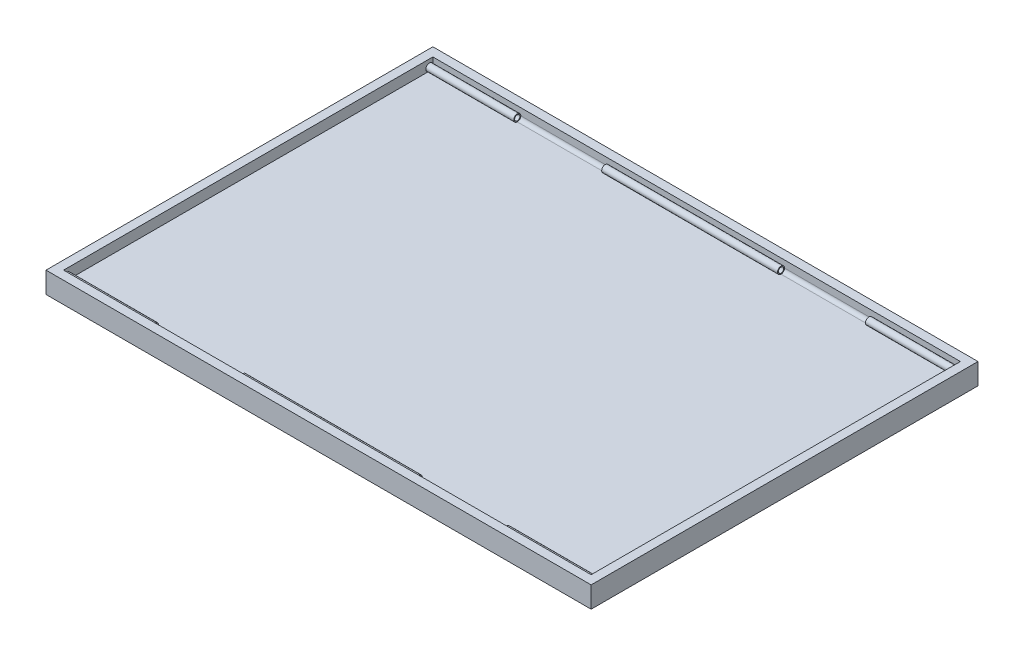
ISO-10303-21;
HEADER;
FILE_DESCRIPTION(('STEP AP214'),'2;1');
FILE_NAME('part.step','',(''),(''),'','','');
FILE_SCHEMA(('AUTOMOTIVE_DESIGN { 1 0 10303 214 1 1 1 1 }'));
ENDSEC;
DATA;
#1=APPLICATION_CONTEXT('core data for automotive mechanical design processes');
#2=APPLICATION_PROTOCOL_DEFINITION('international standard','automotive_design',2000,#1);
#3=PRODUCT_CONTEXT('',#1,'mechanical');
#4=PRODUCT('Part','Part','',(#3));
#5=PRODUCT_RELATED_PRODUCT_CATEGORY('part','',(#4));
#6=PRODUCT_DEFINITION_FORMATION('','',#4);
#7=PRODUCT_DEFINITION_CONTEXT('part definition',#1,'design');
#8=PRODUCT_DEFINITION('design','',#6,#7);
#9=PRODUCT_DEFINITION_SHAPE('','',#8);
#10=(LENGTH_UNIT() NAMED_UNIT(*) SI_UNIT(.MILLI.,.METRE.));
#11=(NAMED_UNIT(*) PLANE_ANGLE_UNIT() SI_UNIT($,.RADIAN.));
#12=(NAMED_UNIT(*) SI_UNIT($,.STERADIAN.) SOLID_ANGLE_UNIT());
#13=UNCERTAINTY_MEASURE_WITH_UNIT(LENGTH_MEASURE(1.E-05),#10,'distance_accuracy_value','');
#14=(GEOMETRIC_REPRESENTATION_CONTEXT(3) GLOBAL_UNCERTAINTY_ASSIGNED_CONTEXT((#13)) GLOBAL_UNIT_ASSIGNED_CONTEXT((#10,
#11,#12)) REPRESENTATION_CONTEXT('',''));
#15=CARTESIAN_POINT('',(0.,0.,0.));
#16=DIRECTION('',(0.,0.,1.));
#17=DIRECTION('',(1.,0.,0.));
#18=AXIS2_PLACEMENT_3D('',#15,#16,#17);
#19=CARTESIAN_POINT('',(-149.339622641509,8.,-125.830188679245));
#20=DIRECTION('',(1.,0.,0.));
#21=DIRECTION('',(0.,0.,-1.));
#22=AXIS2_PLACEMENT_3D('',#19,#20,#21);
#23=CYLINDRICAL_SURFACE('',#22,2.);
#24=DIRECTION('',(1.,0.,0.));
#25=VECTOR('',#24,1.);
#26=CARTESIAN_POINT('',(-149.339622641509,6.,-125.830188679245));
#27=LINE('',#26,#25);
#28=CARTESIAN_POINT('',(-149.339622641509,6.,-125.830188679245));
#29=VERTEX_POINT('',#28);
#30=CARTESIAN_POINT('',(-99.3396226415094,6.,-125.830188679245));
#31=VERTEX_POINT('',#30);
#32=EDGE_CURVE('E205',#29,#31,#27,.T.);
#33=ORIENTED_EDGE('',*,*,#32,.T.);
#34=CARTESIAN_POINT('',(-99.3396226415094,8.,-125.830188679245));
#35=DIRECTION('',(1.,0.,0.));
#36=DIRECTION('',(0.,0.,-1.));
#37=AXIS2_PLACEMENT_3D('',#34,#35,#36);
#38=CIRCLE('',#37,1.99999999999997);
#39=CARTESIAN_POINT('',(-99.3396226415094,8.,-127.830188679245));
#40=VERTEX_POINT('',#39);
#41=EDGE_CURVE('E282',#40,#31,#38,.T.);
#42=ORIENTED_EDGE('',*,*,#41,.F.);
#43=DIRECTION('',(-1.,0.,0.));
#44=VECTOR('',#43,1.);
#45=CARTESIAN_POINT('',(-149.339622641509,8.,-127.830188679245));
#46=LINE('',#45,#44);
#47=CARTESIAN_POINT('',(-149.339622641509,8.,-127.830188679245));
#48=VERTEX_POINT('',#47);
#49=EDGE_CURVE('E208',#40,#48,#46,.T.);
#50=ORIENTED_EDGE('',*,*,#49,.T.);
#51=CARTESIAN_POINT('',(-149.339622641509,8.,-125.830188679245));
#52=DIRECTION('',(1.,0.,0.));
#53=DIRECTION('',(0.,0.,-1.));
#54=AXIS2_PLACEMENT_3D('',#51,#52,#53);
#55=CIRCLE('',#54,2.);
#56=EDGE_CURVE('E249',#48,#29,#55,.T.);
#57=ORIENTED_EDGE('',*,*,#56,.T.);
#58=EDGE_LOOP('',(#33,#42,#50,#57));
#59=FACE_BOUND('',#58,.T.);
#60=ADVANCED_FACE('F49',(#59),#23,.T.);
#61=CARTESIAN_POINT('',(-149.339622641509,8.,80.1698113207547));
#62=DIRECTION('',(1.,0.,0.));
#63=DIRECTION('',(0.,0.,-1.));
#64=AXIS2_PLACEMENT_3D('',#61,#62,#63);
#65=CYLINDRICAL_SURFACE('',#64,2.);
#66=DIRECTION('',(1.,0.,0.));
#67=VECTOR('',#66,1.);
#68=CARTESIAN_POINT('',(-149.339622641509,8.,82.1698113207547));
#69=LINE('',#68,#67);
#70=CARTESIAN_POINT('',(-149.339622641509,8.,82.1698113207547));
#71=VERTEX_POINT('',#70);
#72=CARTESIAN_POINT('',(-99.3396226415094,8.,82.1698113207547));
#73=VERTEX_POINT('',#72);
#74=EDGE_CURVE('E211',#71,#73,#69,.T.);
#75=ORIENTED_EDGE('',*,*,#74,.T.);
#76=CARTESIAN_POINT('',(-99.3396226415094,8.,80.1698113207547));
#77=DIRECTION('',(1.,0.,0.));
#78=DIRECTION('',(0.,0.,-1.));
#79=AXIS2_PLACEMENT_3D('',#76,#77,#78);
#80=CIRCLE('',#79,2.);
#81=CARTESIAN_POINT('',(-99.3396226415094,6.,80.1698113207547));
#82=VERTEX_POINT('',#81);
#83=EDGE_CURVE('E279',#82,#73,#80,.T.);
#84=ORIENTED_EDGE('',*,*,#83,.F.);
#85=DIRECTION('',(-1.,0.,0.));
#86=VECTOR('',#85,1.);
#87=CARTESIAN_POINT('',(-149.339622641509,6.,80.1698113207547));
#88=LINE('',#87,#86);
#89=CARTESIAN_POINT('',(-149.339622641509,6.,80.1698113207547));
#90=VERTEX_POINT('',#89);
#91=EDGE_CURVE('E240',#82,#90,#88,.T.);
#92=ORIENTED_EDGE('',*,*,#91,.T.);
#93=CARTESIAN_POINT('',(-149.339622641509,8.,80.1698113207547));
#94=DIRECTION('',(1.,0.,0.));
#95=DIRECTION('',(0.,0.,-1.));
#96=AXIS2_PLACEMENT_3D('',#93,#94,#95);
#97=CIRCLE('',#96,2.);
#98=EDGE_CURVE('E242',#90,#71,#97,.T.);
#99=ORIENTED_EDGE('',*,*,#98,.T.);
#100=EDGE_LOOP('',(#75,#84,#92,#99));
#101=FACE_BOUND('',#100,.T.);
#102=ADVANCED_FACE('F359',(#101),#65,.T.);
#103=CARTESIAN_POINT('',(-49.3396226415094,8.,-125.830188679245));
#104=DIRECTION('',(1.,0.,0.));
#105=DIRECTION('',(0.,0.,-1.));
#106=AXIS2_PLACEMENT_3D('',#103,#104,#105);
#107=CIRCLE('',#106,1.99999999999997);
#108=CARTESIAN_POINT('',(-49.3396226415094,8.,-127.830188679245));
#109=VERTEX_POINT('',#108);
#110=CARTESIAN_POINT('',(-49.3396226415094,6.,-125.830188679245));
#111=VERTEX_POINT('',#110);
#112=EDGE_CURVE('E65',#109,#111,#107,.T.);
#113=ORIENTED_EDGE('',*,*,#112,.T.);
#114=CARTESIAN_POINT('',(50.6603773584906,6.00000000000003,-125.830188679245));
#115=VERTEX_POINT('',#114);
#116=EDGE_CURVE('E195',#111,#115,#27,.T.);
#117=ORIENTED_EDGE('',*,*,#116,.T.);
#118=CARTESIAN_POINT('',(50.6603773584906,8.,-125.830188679245));
#119=DIRECTION('',(1.,0.,0.));
#120=DIRECTION('',(0.,0.,-1.));
#121=AXIS2_PLACEMENT_3D('',#118,#119,#120);
#122=CIRCLE('',#121,1.99999999999997);
#123=CARTESIAN_POINT('',(50.6603773584906,8.,-127.830188679245));
#124=VERTEX_POINT('',#123);
#125=EDGE_CURVE('E268',#124,#115,#122,.T.);
#126=ORIENTED_EDGE('',*,*,#125,.F.);
#127=EDGE_CURVE('E198',#124,#109,#46,.T.);
#128=ORIENTED_EDGE('',*,*,#127,.T.);
#129=EDGE_LOOP('',(#113,#117,#126,#128));
#130=FACE_BOUND('',#129,.T.);
#131=ADVANCED_FACE('F193',(#130),#23,.T.);
#132=CARTESIAN_POINT('',(-49.3396226415094,8.,80.1698113207547));
#133=DIRECTION('',(1.,0.,0.));
#134=DIRECTION('',(0.,0.,-1.));
#135=AXIS2_PLACEMENT_3D('',#132,#133,#134);
#136=CIRCLE('',#135,2.);
#137=CARTESIAN_POINT('',(-49.3396226415094,6.,80.1698113207547));
#138=VERTEX_POINT('',#137);
#139=CARTESIAN_POINT('',(-49.3396226415094,8.,82.1698113207547));
#140=VERTEX_POINT('',#139);
#141=EDGE_CURVE('E186',#138,#140,#136,.T.);
#142=ORIENTED_EDGE('',*,*,#141,.T.);
#143=CARTESIAN_POINT('',(50.6603773584906,8.,82.1698113207547));
#144=VERTEX_POINT('',#143);
#145=EDGE_CURVE('E219',#140,#144,#69,.T.);
#146=ORIENTED_EDGE('',*,*,#145,.T.);
#147=CARTESIAN_POINT('',(50.6603773584906,8.,80.1698113207547));
#148=DIRECTION('',(1.,0.,0.));
#149=DIRECTION('',(0.,0.,-1.));
#150=AXIS2_PLACEMENT_3D('',#147,#148,#149);
#151=CIRCLE('',#150,2.);
#152=CARTESIAN_POINT('',(50.6603773584906,6.,80.1698113207547));
#153=VERTEX_POINT('',#152);
#154=EDGE_CURVE('E258',#153,#144,#151,.T.);
#155=ORIENTED_EDGE('',*,*,#154,.F.);
#156=EDGE_CURVE('E241',#153,#138,#88,.T.);
#157=ORIENTED_EDGE('',*,*,#156,.T.);
#158=EDGE_LOOP('',(#142,#146,#155,#157));
#159=FACE_BOUND('',#158,.T.);
#160=ADVANCED_FACE('F364',(#159),#65,.T.);
#161=CARTESIAN_POINT('',(-149.339622641509,6.,-127.830188679245));
#162=DIRECTION('',(-1.,0.,0.));
#163=DIRECTION('',(0.,0.,1.));
#164=AXIS2_PLACEMENT_3D('',#161,#162,#163);
#165=PLANE('',#164);
#166=DIRECTION('',(0.,0.,1.));
#167=VECTOR('',#166,1.);
#168=CARTESIAN_POINT('',(-149.339622641509,6.,-127.830188679245));
#169=LINE('',#168,#167);
#170=EDGE_CURVE('E383',#29,#90,#169,.T.);
#171=ORIENTED_EDGE('',*,*,#170,.F.);
#172=ORIENTED_EDGE('',*,*,#56,.F.);
#173=DIRECTION('',(0.,1.,0.));
#174=VECTOR('',#173,1.);
#175=CARTESIAN_POINT('',(-149.339622641509,6.,-127.830188679245));
#176=LINE('',#175,#174);
#177=CARTESIAN_POINT('',(-149.339622641509,12.,-127.830188679245));
#178=VERTEX_POINT('',#177);
#179=EDGE_CURVE('E296',#48,#178,#176,.T.);
#180=ORIENTED_EDGE('',*,*,#179,.T.);
#181=DIRECTION('',(0.,0.,1.));
#182=VECTOR('',#181,1.);
#183=CARTESIAN_POINT('',(-149.339622641509,12.,-127.830188679245));
#184=LINE('',#183,#182);
#185=CARTESIAN_POINT('',(-149.339622641509,12.,82.1698113207547));
#186=VERTEX_POINT('',#185);
#187=EDGE_CURVE('E300',#178,#186,#184,.T.);
#188=ORIENTED_EDGE('',*,*,#187,.T.);
#189=DIRECTION('',(0.,1.,0.));
#190=VECTOR('',#189,1.);
#191=CARTESIAN_POINT('',(-149.339622641509,6.,82.1698113207547));
#192=LINE('',#191,#190);
#193=EDGE_CURVE('E382',#71,#186,#192,.T.);
#194=ORIENTED_EDGE('',*,*,#193,.F.);
#195=ORIENTED_EDGE('',*,*,#98,.F.);
#196=EDGE_LOOP('',(#171,#172,#180,#188,#194,#195));
#197=FACE_BOUND('',#196,.T.);
#198=ADVANCED_FACE('F347',(#197),#165,.F.);
#199=CARTESIAN_POINT('',(150.660377358491,6.,-127.830188679245));
#200=DIRECTION('',(1.,0.,0.));
#201=DIRECTION('',(0.,0.,-1.));
#202=AXIS2_PLACEMENT_3D('',#199,#200,#201);
#203=PLANE('',#202);
#204=DIRECTION('',(0.,1.,0.));
#205=VECTOR('',#204,1.);
#206=CARTESIAN_POINT('',(150.660377358491,6.,-127.830188679245));
#207=LINE('',#206,#205);
#208=CARTESIAN_POINT('',(150.660377358491,8.,-127.830188679245));
#209=VERTEX_POINT('',#208);
#210=CARTESIAN_POINT('',(150.660377358491,12.,-127.830188679245));
#211=VERTEX_POINT('',#210);
#212=EDGE_CURVE('E397',#209,#211,#207,.T.);
#213=ORIENTED_EDGE('',*,*,#212,.F.);
#214=CARTESIAN_POINT('',(150.660377358491,8.,-125.830188679245));
#215=DIRECTION('',(1.,0.,0.));
#216=DIRECTION('',(0.,0.,-1.));
#217=AXIS2_PLACEMENT_3D('',#214,#215,#216);
#218=CIRCLE('',#217,2.);
#219=CARTESIAN_POINT('',(150.660377358491,6.,-125.830188679245));
#220=VERTEX_POINT('',#219);
#221=EDGE_CURVE('E251',#209,#220,#218,.T.);
#222=ORIENTED_EDGE('',*,*,#221,.T.);
#223=DIRECTION('',(0.,0.,-1.));
#224=VECTOR('',#223,1.);
#225=CARTESIAN_POINT('',(150.660377358491,6.,-127.830188679245));
#226=LINE('',#225,#224);
#227=CARTESIAN_POINT('',(150.660377358491,6.,80.1698113207547));
#228=VERTEX_POINT('',#227);
#229=EDGE_CURVE('E379',#228,#220,#226,.T.);
#230=ORIENTED_EDGE('',*,*,#229,.F.);
#231=CARTESIAN_POINT('',(150.660377358491,8.,80.1698113207547));
#232=DIRECTION('',(1.,0.,0.));
#233=DIRECTION('',(0.,0.,-1.));
#234=AXIS2_PLACEMENT_3D('',#231,#232,#233);
#235=CIRCLE('',#234,2.);
#236=CARTESIAN_POINT('',(150.660377358491,8.,82.1698113207547));
#237=VERTEX_POINT('',#236);
#238=EDGE_CURVE('E246',#228,#237,#235,.T.);
#239=ORIENTED_EDGE('',*,*,#238,.T.);
#240=DIRECTION('',(0.,1.,0.));
#241=VECTOR('',#240,1.);
#242=CARTESIAN_POINT('',(150.660377358491,6.,82.1698113207547));
#243=LINE('',#242,#241);
#244=CARTESIAN_POINT('',(150.660377358491,12.,82.1698113207547));
#245=VERTEX_POINT('',#244);
#246=EDGE_CURVE('E385',#237,#245,#243,.T.);
#247=ORIENTED_EDGE('',*,*,#246,.T.);
#248=DIRECTION('',(0.,0.,-1.));
#249=VECTOR('',#248,1.);
#250=CARTESIAN_POINT('',(150.660377358491,12.,-127.830188679245));
#251=LINE('',#250,#249);
#252=EDGE_CURVE('E391',#245,#211,#251,.T.);
#253=ORIENTED_EDGE('',*,*,#252,.T.);
#254=EDGE_LOOP('',(#213,#222,#230,#239,#247,#253));
#255=FACE_BOUND('',#254,.T.);
#256=ADVANCED_FACE('F465',(#255),#203,.F.);
#257=CARTESIAN_POINT('',(0.,6.,0.));
#258=DIRECTION('',(0.,1.,0.));
#259=DIRECTION('',(0.,0.,1.));
#260=AXIS2_PLACEMENT_3D('',#257,#258,#259);
#261=PLANE('',#260);
#262=ORIENTED_EDGE('',*,*,#170,.T.);
#263=ORIENTED_EDGE('',*,*,#91,.F.);
#264=DIRECTION('',(1.,0.,0.));
#265=VECTOR('',#264,1.);
#266=CARTESIAN_POINT('',(-99.3396226415094,6.,80.1698113207547));
#267=LINE('',#266,#265);
#268=EDGE_CURVE('E272',#82,#138,#267,.T.);
#269=ORIENTED_EDGE('',*,*,#268,.T.);
#270=ORIENTED_EDGE('',*,*,#156,.F.);
#271=CARTESIAN_POINT('',(100.660377358491,6.,80.1698113207547));
#272=VERTEX_POINT('',#271);
#273=EDGE_CURVE('E239',#272,#153,#88,.T.);
#274=ORIENTED_EDGE('',*,*,#273,.F.);
#275=EDGE_CURVE('E233',#228,#272,#88,.T.);
#276=ORIENTED_EDGE('',*,*,#275,.F.);
#277=ORIENTED_EDGE('',*,*,#229,.T.);
#278=CARTESIAN_POINT('',(100.660377358491,6.,-125.830188679245));
#279=VERTEX_POINT('',#278);
#280=EDGE_CURVE('E207',#279,#220,#27,.T.);
#281=ORIENTED_EDGE('',*,*,#280,.F.);
#282=EDGE_CURVE('E204',#115,#279,#27,.T.);
#283=ORIENTED_EDGE('',*,*,#282,.F.);
#284=ORIENTED_EDGE('',*,*,#116,.F.);
#285=DIRECTION('',(1.,0.,0.));
#286=VECTOR('',#285,1.);
#287=CARTESIAN_POINT('',(-99.3396226415094,6.00000000000002,-125.830188679245));
#288=LINE('',#287,#286);
#289=EDGE_CURVE('E176',#31,#111,#288,.T.);
#290=ORIENTED_EDGE('',*,*,#289,.F.);
#291=ORIENTED_EDGE('',*,*,#32,.F.);
#292=EDGE_LOOP('',(#262,#263,#269,#270,#274,#276,#277,#281,#283,#284,#290,#291));
#293=FACE_BOUND('',#292,.T.);
#294=ADVANCED_FACE('F201',(#293),#261,.T.);
#295=CARTESIAN_POINT('',(-149.339622641509,6.,82.1698113207547));
#296=DIRECTION('',(0.,0.,1.));
#297=DIRECTION('',(1.,0.,0.));
#298=AXIS2_PLACEMENT_3D('',#295,#296,#297);
#299=PLANE('',#298);
#300=ORIENTED_EDGE('',*,*,#74,.F.);
#301=ORIENTED_EDGE('',*,*,#193,.T.);
#302=DIRECTION('',(1.,0.,0.));
#303=VECTOR('',#302,1.);
#304=CARTESIAN_POINT('',(-149.339622641509,12.,82.1698113207547));
#305=LINE('',#304,#303);
#306=EDGE_CURVE('E303',#186,#245,#305,.T.);
#307=ORIENTED_EDGE('',*,*,#306,.T.);
#308=ORIENTED_EDGE('',*,*,#246,.F.);
#309=CARTESIAN_POINT('',(100.660377358491,8.,82.1698113207547));
#310=VERTEX_POINT('',#309);
#311=EDGE_CURVE('E224',#310,#237,#69,.T.);
#312=ORIENTED_EDGE('',*,*,#311,.F.);
#313=EDGE_CURVE('E220',#144,#310,#69,.T.);
#314=ORIENTED_EDGE('',*,*,#313,.F.);
#315=ORIENTED_EDGE('',*,*,#145,.F.);
#316=EDGE_CURVE('E217',#73,#140,#69,.T.);
#317=ORIENTED_EDGE('',*,*,#316,.F.);
#318=EDGE_LOOP('',(#300,#301,#307,#308,#312,#314,#315,#317));
#319=FACE_BOUND('',#318,.T.);
#320=ADVANCED_FACE('F543',(#319),#299,.F.);
#321=CARTESIAN_POINT('',(-154.339622641509,12.,-132.830188679245));
#322=DIRECTION('',(1.,0.,0.));
#323=DIRECTION('',(0.,0.,-1.));
#324=AXIS2_PLACEMENT_3D('',#321,#322,#323);
#325=PLANE('',#324);
#326=DIRECTION('',(0.,0.,1.));
#327=VECTOR('',#326,1.);
#328=CARTESIAN_POINT('',(-154.339622641509,0.,-132.830188679245));
#329=LINE('',#328,#327);
#330=CARTESIAN_POINT('',(-154.339622641509,0.,-132.830188679245));
#331=VERTEX_POINT('',#330);
#332=CARTESIAN_POINT('',(-154.339622641509,0.,87.1698113207547));
#333=VERTEX_POINT('',#332);
#334=EDGE_CURVE('E396',#331,#333,#329,.T.);
#335=ORIENTED_EDGE('',*,*,#334,.T.);
#336=DIRECTION('',(0.,-1.,0.));
#337=VECTOR('',#336,1.);
#338=CARTESIAN_POINT('',(-154.339622641509,12.,87.1698113207547));
#339=LINE('',#338,#337);
#340=CARTESIAN_POINT('',(-154.339622641509,12.,87.1698113207547));
#341=VERTEX_POINT('',#340);
#342=EDGE_CURVE('E426',#341,#333,#339,.T.);
#343=ORIENTED_EDGE('',*,*,#342,.F.);
#344=DIRECTION('',(0.,0.,1.));
#345=VECTOR('',#344,1.);
#346=CARTESIAN_POINT('',(-154.339622641509,12.,-132.830188679245));
#347=LINE('',#346,#345);
#348=CARTESIAN_POINT('',(-154.339622641509,12.,-132.830188679245));
#349=VERTEX_POINT('',#348);
#350=EDGE_CURVE('E400',#349,#341,#347,.T.);
#351=ORIENTED_EDGE('',*,*,#350,.F.);
#352=DIRECTION('',(0.,-1.,0.));
#353=VECTOR('',#352,1.);
#354=CARTESIAN_POINT('',(-154.339622641509,12.,-132.830188679245));
#355=LINE('',#354,#353);
#356=EDGE_CURVE('E410',#349,#331,#355,.T.);
#357=ORIENTED_EDGE('',*,*,#356,.T.);
#358=EDGE_LOOP('',(#335,#343,#351,#357));
#359=FACE_BOUND('',#358,.T.);
#360=ADVANCED_FACE('F51',(#359),#325,.F.);
#361=CARTESIAN_POINT('',(-154.339622641509,12.,87.1698113207547));
#362=DIRECTION('',(0.,0.,-1.));
#363=DIRECTION('',(-1.,0.,0.));
#364=AXIS2_PLACEMENT_3D('',#361,#362,#363);
#365=PLANE('',#364);
#366=DIRECTION('',(1.,0.,0.));
#367=VECTOR('',#366,1.);
#368=CARTESIAN_POINT('',(-154.339622641509,0.,87.1698113207547));
#369=LINE('',#368,#367);
#370=CARTESIAN_POINT('',(155.660377358491,0.,87.1698113207547));
#371=VERTEX_POINT('',#370);
#372=EDGE_CURVE('E413',#333,#371,#369,.T.);
#373=ORIENTED_EDGE('',*,*,#372,.T.);
#374=DIRECTION('',(0.,-1.,0.));
#375=VECTOR('',#374,1.);
#376=CARTESIAN_POINT('',(155.660377358491,12.,87.1698113207547));
#377=LINE('',#376,#375);
#378=CARTESIAN_POINT('',(155.660377358491,12.,87.1698113207547));
#379=VERTEX_POINT('',#378);
#380=EDGE_CURVE('E423',#379,#371,#377,.T.);
#381=ORIENTED_EDGE('',*,*,#380,.F.);
#382=DIRECTION('',(1.,0.,0.));
#383=VECTOR('',#382,1.);
#384=CARTESIAN_POINT('',(-154.339622641509,12.,87.1698113207547));
#385=LINE('',#384,#383);
#386=EDGE_CURVE('E403',#341,#379,#385,.T.);
#387=ORIENTED_EDGE('',*,*,#386,.F.);
#388=ORIENTED_EDGE('',*,*,#342,.T.);
#389=EDGE_LOOP('',(#373,#381,#387,#388));
#390=FACE_BOUND('',#389,.T.);
#391=ADVANCED_FACE('F740',(#390),#365,.F.);
#392=CARTESIAN_POINT('',(155.660377358491,12.,-132.830188679245));
#393=DIRECTION('',(-1.,0.,0.));
#394=DIRECTION('',(0.,0.,1.));
#395=AXIS2_PLACEMENT_3D('',#392,#393,#394);
#396=PLANE('',#395);
#397=DIRECTION('',(0.,0.,-1.));
#398=VECTOR('',#397,1.);
#399=CARTESIAN_POINT('',(155.660377358491,0.,-132.830188679245));
#400=LINE('',#399,#398);
#401=CARTESIAN_POINT('',(155.660377358491,0.,-132.830188679245));
#402=VERTEX_POINT('',#401);
#403=EDGE_CURVE('E415',#371,#402,#400,.T.);
#404=ORIENTED_EDGE('',*,*,#403,.T.);
#405=DIRECTION('',(0.,-1.,0.));
#406=VECTOR('',#405,1.);
#407=CARTESIAN_POINT('',(155.660377358491,12.,-132.830188679245));
#408=LINE('',#407,#406);
#409=CARTESIAN_POINT('',(155.660377358491,12.,-132.830188679245));
#410=VERTEX_POINT('',#409);
#411=EDGE_CURVE('E420',#410,#402,#408,.T.);
#412=ORIENTED_EDGE('',*,*,#411,.F.);
#413=DIRECTION('',(0.,0.,-1.));
#414=VECTOR('',#413,1.);
#415=CARTESIAN_POINT('',(155.660377358491,12.,-132.830188679245));
#416=LINE('',#415,#414);
#417=EDGE_CURVE('E406',#379,#410,#416,.T.);
#418=ORIENTED_EDGE('',*,*,#417,.F.);
#419=ORIENTED_EDGE('',*,*,#380,.T.);
#420=EDGE_LOOP('',(#404,#412,#418,#419));
#421=FACE_BOUND('',#420,.T.);
#422=ADVANCED_FACE('F737',(#421),#396,.F.);
#423=CARTESIAN_POINT('',(-154.339622641509,12.,-132.830188679245));
#424=DIRECTION('',(0.,0.,1.));
#425=DIRECTION('',(1.,0.,0.));
#426=AXIS2_PLACEMENT_3D('',#423,#424,#425);
#427=PLANE('',#426);
#428=DIRECTION('',(-1.,0.,0.));
#429=VECTOR('',#428,1.);
#430=CARTESIAN_POINT('',(-154.339622641509,0.,-132.830188679245));
#431=LINE('',#430,#429);
#432=EDGE_CURVE('E404',#402,#331,#431,.T.);
#433=ORIENTED_EDGE('',*,*,#432,.T.);
#434=ORIENTED_EDGE('',*,*,#356,.F.);
#435=DIRECTION('',(-1.,0.,0.));
#436=VECTOR('',#435,1.);
#437=CARTESIAN_POINT('',(-154.339622641509,12.,-132.830188679245));
#438=LINE('',#437,#436);
#439=EDGE_CURVE('E408',#410,#349,#438,.T.);
#440=ORIENTED_EDGE('',*,*,#439,.F.);
#441=ORIENTED_EDGE('',*,*,#411,.T.);
#442=EDGE_LOOP('',(#433,#434,#440,#441));
#443=FACE_BOUND('',#442,.T.);
#444=ADVANCED_FACE('F731',(#443),#427,.F.);
#445=CARTESIAN_POINT('',(0.,12.,0.));
#446=DIRECTION('',(0.,1.,0.));
#447=DIRECTION('',(0.,0.,1.));
#448=AXIS2_PLACEMENT_3D('',#445,#446,#447);
#449=PLANE('',#448);
#450=ORIENTED_EDGE('',*,*,#187,.F.);
#451=DIRECTION('',(-1.,0.,0.));
#452=VECTOR('',#451,1.);
#453=CARTESIAN_POINT('',(-149.339622641509,12.,-127.830188679245));
#454=LINE('',#453,#452);
#455=EDGE_CURVE('E387',#211,#178,#454,.T.);
#456=ORIENTED_EDGE('',*,*,#455,.F.);
#457=ORIENTED_EDGE('',*,*,#252,.F.);
#458=ORIENTED_EDGE('',*,*,#306,.F.);
#459=EDGE_LOOP('',(#450,#456,#457,#458));
#460=FACE_BOUND('',#459,.T.);
#461=ORIENTED_EDGE('',*,*,#350,.T.);
#462=ORIENTED_EDGE('',*,*,#386,.T.);
#463=ORIENTED_EDGE('',*,*,#417,.T.);
#464=ORIENTED_EDGE('',*,*,#439,.T.);
#465=EDGE_LOOP('',(#461,#462,#463,#464));
#466=FACE_BOUND('',#465,.T.);
#467=ADVANCED_FACE('F682',(#460,#466),#449,.T.);
#468=CARTESIAN_POINT('',(0.,0.,0.));
#469=DIRECTION('',(0.,1.,0.));
#470=DIRECTION('',(0.,0.,1.));
#471=AXIS2_PLACEMENT_3D('',#468,#469,#470);
#472=PLANE('',#471);
#473=ORIENTED_EDGE('',*,*,#334,.F.);
#474=ORIENTED_EDGE('',*,*,#432,.F.);
#475=ORIENTED_EDGE('',*,*,#403,.F.);
#476=ORIENTED_EDGE('',*,*,#372,.F.);
#477=EDGE_LOOP('',(#473,#474,#475,#476));
#478=FACE_BOUND('',#477,.T.);
#479=ADVANCED_FACE('F564',(#478),#472,.F.);
#480=CARTESIAN_POINT('',(-149.339622641509,6.,-127.830188679245));
#481=DIRECTION('',(0.,0.,-1.));
#482=DIRECTION('',(-1.,0.,0.));
#483=AXIS2_PLACEMENT_3D('',#480,#481,#482);
#484=PLANE('',#483);
#485=ORIENTED_EDGE('',*,*,#179,.F.);
#486=ORIENTED_EDGE('',*,*,#49,.F.);
#487=EDGE_CURVE('E294',#109,#40,#46,.T.);
#488=ORIENTED_EDGE('',*,*,#487,.F.);
#489=ORIENTED_EDGE('',*,*,#127,.F.);
#490=CARTESIAN_POINT('',(100.660377358491,8.,-127.830188679245));
#491=VERTEX_POINT('',#490);
#492=EDGE_CURVE('E301',#491,#124,#46,.T.);
#493=ORIENTED_EDGE('',*,*,#492,.F.);
#494=EDGE_CURVE('E298',#209,#491,#46,.T.);
#495=ORIENTED_EDGE('',*,*,#494,.F.);
#496=ORIENTED_EDGE('',*,*,#212,.T.);
#497=ORIENTED_EDGE('',*,*,#455,.T.);
#498=EDGE_LOOP('',(#485,#486,#488,#489,#493,#495,#496,#497));
#499=FACE_BOUND('',#498,.T.);
#500=ADVANCED_FACE('F293',(#499),#484,.F.);
#501=CARTESIAN_POINT('',(100.660377358491,8.,80.1698113207547));
#502=DIRECTION('',(1.,0.,0.));
#503=DIRECTION('',(0.,0.,-1.));
#504=AXIS2_PLACEMENT_3D('',#501,#502,#503);
#505=CIRCLE('',#504,2.);
#506=EDGE_CURVE('E259',#272,#310,#505,.T.);
#507=ORIENTED_EDGE('',*,*,#506,.T.);
#508=ORIENTED_EDGE('',*,*,#311,.T.);
#509=ORIENTED_EDGE('',*,*,#238,.F.);
#510=ORIENTED_EDGE('',*,*,#275,.T.);
#511=EDGE_LOOP('',(#507,#508,#509,#510));
#512=FACE_BOUND('',#511,.T.);
#513=ADVANCED_FACE('F365',(#512),#65,.T.);
#514=CARTESIAN_POINT('',(100.660377358491,8.,-125.830188679245));
#515=DIRECTION('',(1.,0.,0.));
#516=DIRECTION('',(0.,0.,-1.));
#517=AXIS2_PLACEMENT_3D('',#514,#515,#516);
#518=CIRCLE('',#517,1.99999999999997);
#519=EDGE_CURVE('E264',#491,#279,#518,.T.);
#520=ORIENTED_EDGE('',*,*,#519,.T.);
#521=ORIENTED_EDGE('',*,*,#280,.T.);
#522=ORIENTED_EDGE('',*,*,#221,.F.);
#523=ORIENTED_EDGE('',*,*,#494,.T.);
#524=EDGE_LOOP('',(#520,#521,#522,#523));
#525=FACE_BOUND('',#524,.T.);
#526=ADVANCED_FACE('F360',(#525),#23,.T.);
#527=CARTESIAN_POINT('',(50.6603773584906,8.,80.1698113207547));
#528=DIRECTION('',(1.,0.,0.));
#529=DIRECTION('',(0.,0.,-1.));
#530=AXIS2_PLACEMENT_3D('',#527,#528,#529);
#531=CYLINDRICAL_SURFACE('',#530,2.);
#532=EDGE_CURVE('E260',#144,#153,#151,.T.);
#533=ORIENTED_EDGE('',*,*,#532,.F.);
#534=ORIENTED_EDGE('',*,*,#313,.T.);
#535=EDGE_CURVE('E256',#310,#272,#505,.T.);
#536=ORIENTED_EDGE('',*,*,#535,.T.);
#537=ORIENTED_EDGE('',*,*,#273,.T.);
#538=EDGE_LOOP('',(#533,#534,#536,#537));
#539=FACE_BOUND('',#538,.T.);
#540=ADVANCED_FACE('F369',(#539),#531,.F.);
#541=CARTESIAN_POINT('',(50.6603773584906,8.,80.1698113207547));
#542=DIRECTION('',(1.,0.,0.));
#543=DIRECTION('',(0.,0.,-1.));
#544=AXIS2_PLACEMENT_3D('',#541,#542,#543);
#545=PLANE('',#544);
#546=ORIENTED_EDGE('',*,*,#532,.T.);
#547=ORIENTED_EDGE('',*,*,#154,.T.);
#548=EDGE_LOOP('',(#546,#547));
#549=FACE_BOUND('',#548,.T.);
#550=CARTESIAN_POINT('',(50.6603773584906,8.,80.1698113207547));
#551=DIRECTION('',(1.,0.,0.));
#552=DIRECTION('',(0.,0.,-1.));
#553=AXIS2_PLACEMENT_3D('',#550,#551,#552);
#554=CIRCLE('',#553,1.5);
#555=CARTESIAN_POINT('',(50.6603773584906,8.,78.6698113207547));
#556=VERTEX_POINT('',#555);
#557=EDGE_CURVE('E253',#556,#556,#554,.F.);
#558=ORIENTED_EDGE('',*,*,#557,.T.);
#559=EDGE_LOOP('',(#558));
#560=FACE_BOUND('',#559,.T.);
#561=ADVANCED_FACE('F374',(#549,#560),#545,.T.);
#562=CARTESIAN_POINT('',(100.660377358491,8.,80.1698113207547));
#563=DIRECTION('',(1.,0.,0.));
#564=DIRECTION('',(0.,0.,-1.));
#565=AXIS2_PLACEMENT_3D('',#562,#563,#564);
#566=PLANE('',#565);
#567=ORIENTED_EDGE('',*,*,#535,.F.);
#568=ORIENTED_EDGE('',*,*,#506,.F.);
#569=EDGE_LOOP('',(#567,#568));
#570=FACE_BOUND('',#569,.T.);
#571=CARTESIAN_POINT('',(100.660377358491,8.,80.1698113207547));
#572=DIRECTION('',(1.,0.,0.));
#573=DIRECTION('',(0.,0.,-1.));
#574=AXIS2_PLACEMENT_3D('',#571,#572,#573);
#575=CIRCLE('',#574,1.5);
#576=CARTESIAN_POINT('',(100.660377358491,8.,78.6698113207547));
#577=VERTEX_POINT('',#576);
#578=EDGE_CURVE('E263',#577,#577,#575,.F.);
#579=ORIENTED_EDGE('',*,*,#578,.F.);
#580=EDGE_LOOP('',(#579));
#581=FACE_BOUND('',#580,.T.);
#582=ADVANCED_FACE('F354',(#570,#581),#566,.F.);
#583=CARTESIAN_POINT('',(-149.339622641509,8.,80.1698113207547));
#584=DIRECTION('',(1.,0.,0.));
#585=DIRECTION('',(0.,0.,-1.));
#586=AXIS2_PLACEMENT_3D('',#583,#584,#585);
#587=CYLINDRICAL_SURFACE('',#586,1.5);
#588=CARTESIAN_POINT('',(-49.3396226415094,8.,80.1698113207547));
#589=DIRECTION('',(1.,0.,0.));
#590=DIRECTION('',(0.,0.,-1.));
#591=AXIS2_PLACEMENT_3D('',#588,#589,#590);
#592=CIRCLE('',#591,1.5);
#593=CARTESIAN_POINT('',(-49.3396226415094,8.,78.6698113207547));
#594=VERTEX_POINT('',#593);
#595=EDGE_CURVE('E280',#594,#594,#592,.F.);
#596=ORIENTED_EDGE('',*,*,#595,.T.);
#597=EDGE_LOOP('',(#596));
#598=FACE_BOUND('',#597,.T.);
#599=ORIENTED_EDGE('',*,*,#557,.F.);
#600=EDGE_LOOP('',(#599));
#601=FACE_BOUND('',#600,.T.);
#602=ADVANCED_FACE('F338',(#598,#601),#587,.F.);
#603=CARTESIAN_POINT('',(150.660377358491,8.,80.1698113207547));
#604=DIRECTION('',(1.,0.,0.));
#605=DIRECTION('',(0.,0.,-1.));
#606=AXIS2_PLACEMENT_3D('',#603,#604,#605);
#607=CIRCLE('',#606,1.5);
#608=CARTESIAN_POINT('',(150.660377358491,8.,78.6698113207547));
#609=VERTEX_POINT('',#608);
#610=EDGE_CURVE('E429',#609,#609,#607,.T.);
#611=ORIENTED_EDGE('',*,*,#610,.F.);
#612=EDGE_LOOP('',(#611));
#613=FACE_BOUND('',#612,.T.);
#614=ADVANCED_FACE('F353',(#613),#203,.F.);
#615=ORIENTED_EDGE('',*,*,#578,.T.);
#616=EDGE_LOOP('',(#615));
#617=FACE_BOUND('',#616,.T.);
#618=ORIENTED_EDGE('',*,*,#610,.T.);
#619=EDGE_LOOP('',(#618));
#620=FACE_BOUND('',#619,.T.);
#621=ADVANCED_FACE('F315',(#617,#620),#587,.F.);
#622=CARTESIAN_POINT('',(50.6603773584906,8.,-125.830188679245));
#623=DIRECTION('',(1.,0.,0.));
#624=DIRECTION('',(0.,0.,-1.));
#625=AXIS2_PLACEMENT_3D('',#622,#623,#624);
#626=PLANE('',#625);
#627=ORIENTED_EDGE('',*,*,#125,.T.);
#628=EDGE_CURVE('E266',#115,#124,#122,.T.);
#629=ORIENTED_EDGE('',*,*,#628,.T.);
#630=EDGE_LOOP('',(#627,#629));
#631=FACE_BOUND('',#630,.T.);
#632=CARTESIAN_POINT('',(50.6603773584906,8.,-125.830188679245));
#633=DIRECTION('',(1.,0.,0.));
#634=DIRECTION('',(0.,0.,-1.));
#635=AXIS2_PLACEMENT_3D('',#632,#633,#634);
#636=CIRCLE('',#635,1.5);
#637=CARTESIAN_POINT('',(50.6603773584906,8.,-127.330188679245));
#638=VERTEX_POINT('',#637);
#639=EDGE_CURVE('E319',#638,#638,#636,.F.);
#640=ORIENTED_EDGE('',*,*,#639,.T.);
#641=EDGE_LOOP('',(#640));
#642=FACE_BOUND('',#641,.T.);
#643=ADVANCED_FACE('F311',(#631,#642),#626,.T.);
#644=CARTESIAN_POINT('',(100.660377358491,8.,-125.830188679245));
#645=DIRECTION('',(1.,0.,0.));
#646=DIRECTION('',(0.,0.,-1.));
#647=AXIS2_PLACEMENT_3D('',#644,#645,#646);
#648=PLANE('',#647);
#649=ORIENTED_EDGE('',*,*,#519,.F.);
#650=EDGE_CURVE('E267',#279,#491,#518,.T.);
#651=ORIENTED_EDGE('',*,*,#650,.F.);
#652=EDGE_LOOP('',(#649,#651));
#653=FACE_BOUND('',#652,.T.);
#654=CARTESIAN_POINT('',(100.660377358491,8.,-125.830188679245));
#655=DIRECTION('',(1.,0.,0.));
#656=DIRECTION('',(0.,0.,-1.));
#657=AXIS2_PLACEMENT_3D('',#654,#655,#656);
#658=CIRCLE('',#657,1.5);
#659=CARTESIAN_POINT('',(100.660377358491,8.,-127.330188679245));
#660=VERTEX_POINT('',#659);
#661=EDGE_CURVE('E271',#660,#660,#658,.F.);
#662=ORIENTED_EDGE('',*,*,#661,.F.);
#663=EDGE_LOOP('',(#662));
#664=FACE_BOUND('',#663,.T.);
#665=ADVANCED_FACE('F314',(#653,#664),#648,.F.);
#666=CARTESIAN_POINT('',(50.6603773584906,8.,-125.830188679245));
#667=DIRECTION('',(1.,0.,0.));
#668=DIRECTION('',(0.,0.,-1.));
#669=AXIS2_PLACEMENT_3D('',#666,#667,#668);
#670=CYLINDRICAL_SURFACE('',#669,1.99999999999997);
#671=ORIENTED_EDGE('',*,*,#282,.T.);
#672=ORIENTED_EDGE('',*,*,#650,.T.);
#673=ORIENTED_EDGE('',*,*,#492,.T.);
#674=ORIENTED_EDGE('',*,*,#628,.F.);
#675=EDGE_LOOP('',(#671,#672,#673,#674));
#676=FACE_BOUND('',#675,.T.);
#677=ADVANCED_FACE('F308',(#676),#670,.F.);
#678=CARTESIAN_POINT('',(-149.339622641509,8.,-125.830188679245));
#679=DIRECTION('',(1.,0.,0.));
#680=DIRECTION('',(0.,0.,-1.));
#681=AXIS2_PLACEMENT_3D('',#678,#679,#680);
#682=CYLINDRICAL_SURFACE('',#681,1.5);
#683=CARTESIAN_POINT('',(-49.3396226415094,8.,-125.830188679245));
#684=DIRECTION('',(1.,0.,0.));
#685=DIRECTION('',(0.,0.,-1.));
#686=AXIS2_PLACEMENT_3D('',#683,#684,#685);
#687=CIRCLE('',#686,1.5);
#688=CARTESIAN_POINT('',(-49.3396226415094,8.,-127.330188679245));
#689=VERTEX_POINT('',#688);
#690=EDGE_CURVE('E283',#689,#689,#687,.F.);
#691=ORIENTED_EDGE('',*,*,#690,.T.);
#692=EDGE_LOOP('',(#691));
#693=FACE_BOUND('',#692,.T.);
#694=ORIENTED_EDGE('',*,*,#639,.F.);
#695=EDGE_LOOP('',(#694));
#696=FACE_BOUND('',#695,.T.);
#697=ADVANCED_FACE('F457',(#693,#696),#682,.F.);
#698=CARTESIAN_POINT('',(150.660377358491,8.,-125.830188679245));
#699=DIRECTION('',(1.,0.,0.));
#700=DIRECTION('',(0.,0.,-1.));
#701=AXIS2_PLACEMENT_3D('',#698,#699,#700);
#702=CIRCLE('',#701,1.5);
#703=CARTESIAN_POINT('',(150.660377358491,8.,-127.330188679245));
#704=VERTEX_POINT('',#703);
#705=EDGE_CURVE('E58',#704,#704,#702,.T.);
#706=ORIENTED_EDGE('',*,*,#705,.F.);
#707=EDGE_LOOP('',(#706));
#708=FACE_BOUND('',#707,.T.);
#709=ADVANCED_FACE('F454',(#708),#203,.F.);
#710=ORIENTED_EDGE('',*,*,#661,.T.);
#711=EDGE_LOOP('',(#710));
#712=FACE_BOUND('',#711,.T.);
#713=ORIENTED_EDGE('',*,*,#705,.T.);
#714=EDGE_LOOP('',(#713));
#715=FACE_BOUND('',#714,.T.);
#716=ADVANCED_FACE('F451',(#712,#715),#682,.F.);
#717=CARTESIAN_POINT('',(-99.3396226415094,8.,80.1698113207547));
#718=DIRECTION('',(1.,0.,0.));
#719=DIRECTION('',(0.,0.,-1.));
#720=AXIS2_PLACEMENT_3D('',#717,#718,#719);
#721=CYLINDRICAL_SURFACE('',#720,2.);
#722=EDGE_CURVE('E73',#73,#82,#80,.T.);
#723=ORIENTED_EDGE('',*,*,#722,.F.);
#724=ORIENTED_EDGE('',*,*,#316,.T.);
#725=EDGE_CURVE('E276',#140,#138,#136,.T.);
#726=ORIENTED_EDGE('',*,*,#725,.T.);
#727=ORIENTED_EDGE('',*,*,#268,.F.);
#728=EDGE_LOOP('',(#723,#724,#726,#727));
#729=FACE_BOUND('',#728,.T.);
#730=ADVANCED_FACE('F453',(#729),#721,.F.);
#731=CARTESIAN_POINT('',(-99.3396226415094,8.,80.1698113207547));
#732=DIRECTION('',(1.,0.,0.));
#733=DIRECTION('',(0.,0.,-1.));
#734=AXIS2_PLACEMENT_3D('',#731,#732,#733);
#735=PLANE('',#734);
#736=ORIENTED_EDGE('',*,*,#722,.T.);
#737=ORIENTED_EDGE('',*,*,#83,.T.);
#738=EDGE_LOOP('',(#736,#737));
#739=FACE_BOUND('',#738,.T.);
#740=CARTESIAN_POINT('',(-99.3396226415094,8.,80.1698113207547));
#741=DIRECTION('',(1.,0.,0.));
#742=DIRECTION('',(0.,0.,-1.));
#743=AXIS2_PLACEMENT_3D('',#740,#741,#742);
#744=CIRCLE('',#743,1.5);
#745=CARTESIAN_POINT('',(-99.3396226415094,8.,78.6698113207547));
#746=VERTEX_POINT('',#745);
#747=EDGE_CURVE('E275',#746,#746,#744,.F.);
#748=ORIENTED_EDGE('',*,*,#747,.T.);
#749=EDGE_LOOP('',(#748));
#750=FACE_BOUND('',#749,.T.);
#751=ADVANCED_FACE('F331',(#739,#750),#735,.T.);
#752=CARTESIAN_POINT('',(-49.3396226415094,8.,80.1698113207547));
#753=DIRECTION('',(1.,0.,0.));
#754=DIRECTION('',(0.,0.,-1.));
#755=AXIS2_PLACEMENT_3D('',#752,#753,#754);
#756=PLANE('',#755);
#757=ORIENTED_EDGE('',*,*,#725,.F.);
#758=ORIENTED_EDGE('',*,*,#141,.F.);
#759=EDGE_LOOP('',(#757,#758));
#760=FACE_BOUND('',#759,.T.);
#761=ORIENTED_EDGE('',*,*,#595,.F.);
#762=EDGE_LOOP('',(#761));
#763=FACE_BOUND('',#762,.T.);
#764=ADVANCED_FACE('F344',(#760,#763),#756,.F.);
#765=CARTESIAN_POINT('',(-149.339622641509,8.,80.1698113207547));
#766=DIRECTION('',(-1.,0.,0.));
#767=DIRECTION('',(0.,0.,1.));
#768=AXIS2_PLACEMENT_3D('',#765,#766,#767);
#769=CIRCLE('',#768,1.5);
#770=CARTESIAN_POINT('',(-149.339622641509,8.,81.6698113207547));
#771=VERTEX_POINT('',#770);
#772=EDGE_CURVE('E432',#771,#771,#769,.T.);
#773=ORIENTED_EDGE('',*,*,#772,.F.);
#774=EDGE_LOOP('',(#773));
#775=FACE_BOUND('',#774,.T.);
#776=ADVANCED_FACE('F335',(#775),#165,.F.);
#777=ORIENTED_EDGE('',*,*,#772,.T.);
#778=EDGE_LOOP('',(#777));
#779=FACE_BOUND('',#778,.T.);
#780=ORIENTED_EDGE('',*,*,#747,.F.);
#781=EDGE_LOOP('',(#780));
#782=FACE_BOUND('',#781,.T.);
#783=ADVANCED_FACE('F333',(#779,#782),#587,.F.);
#784=CARTESIAN_POINT('',(-99.3396226415094,8.,-125.830188679245));
#785=DIRECTION('',(1.,0.,0.));
#786=DIRECTION('',(0.,0.,-1.));
#787=AXIS2_PLACEMENT_3D('',#784,#785,#786);
#788=PLANE('',#787);
#789=ORIENTED_EDGE('',*,*,#41,.T.);
#790=EDGE_CURVE('E181',#31,#40,#38,.T.);
#791=ORIENTED_EDGE('',*,*,#790,.T.);
#792=EDGE_LOOP('',(#789,#791));
#793=FACE_BOUND('',#792,.T.);
#794=CARTESIAN_POINT('',(-99.3396226415094,8.,-125.830188679245));
#795=DIRECTION('',(1.,0.,0.));
#796=DIRECTION('',(0.,0.,-1.));
#797=AXIS2_PLACEMENT_3D('',#794,#795,#796);
#798=CIRCLE('',#797,1.5);
#799=CARTESIAN_POINT('',(-99.3396226415094,8.,-127.330188679245));
#800=VERTEX_POINT('',#799);
#801=EDGE_CURVE('E53',#800,#800,#798,.F.);
#802=ORIENTED_EDGE('',*,*,#801,.T.);
#803=EDGE_LOOP('',(#802));
#804=FACE_BOUND('',#803,.T.);
#805=ADVANCED_FACE('F287',(#793,#804),#788,.T.);
#806=CARTESIAN_POINT('',(-49.3396226415094,8.,-125.830188679245));
#807=DIRECTION('',(1.,0.,0.));
#808=DIRECTION('',(0.,0.,-1.));
#809=AXIS2_PLACEMENT_3D('',#806,#807,#808);
#810=PLANE('',#809);
#811=ORIENTED_EDGE('',*,*,#112,.F.);
#812=EDGE_CURVE('E178',#111,#109,#107,.T.);
#813=ORIENTED_EDGE('',*,*,#812,.F.);
#814=EDGE_LOOP('',(#811,#813));
#815=FACE_BOUND('',#814,.T.);
#816=ORIENTED_EDGE('',*,*,#690,.F.);
#817=EDGE_LOOP('',(#816));
#818=FACE_BOUND('',#817,.T.);
#819=ADVANCED_FACE('F188',(#815,#818),#810,.F.);
#820=CARTESIAN_POINT('',(-99.3396226415094,8.,-125.830188679245));
#821=DIRECTION('',(1.,0.,0.));
#822=DIRECTION('',(0.,0.,-1.));
#823=AXIS2_PLACEMENT_3D('',#820,#821,#822);
#824=CYLINDRICAL_SURFACE('',#823,1.99999999999997);
#825=ORIENTED_EDGE('',*,*,#289,.T.);
#826=ORIENTED_EDGE('',*,*,#812,.T.);
#827=ORIENTED_EDGE('',*,*,#487,.T.);
#828=ORIENTED_EDGE('',*,*,#790,.F.);
#829=EDGE_LOOP('',(#825,#826,#827,#828));
#830=FACE_BOUND('',#829,.T.);
#831=ADVANCED_FACE('F177',(#830),#824,.F.);
#832=CARTESIAN_POINT('',(-149.339622641509,8.,-125.830188679245));
#833=DIRECTION('',(-1.,0.,0.));
#834=DIRECTION('',(0.,0.,1.));
#835=AXIS2_PLACEMENT_3D('',#832,#833,#834);
#836=CIRCLE('',#835,1.5);
#837=CARTESIAN_POINT('',(-149.339622641509,8.,-124.330188679245));
#838=VERTEX_POINT('',#837);
#839=EDGE_CURVE('E12',#838,#838,#836,.T.);
#840=ORIENTED_EDGE('',*,*,#839,.F.);
#841=EDGE_LOOP('',(#840));
#842=FACE_BOUND('',#841,.T.);
#843=ADVANCED_FACE('F348',(#842),#165,.F.);
#844=ORIENTED_EDGE('',*,*,#839,.T.);
#845=EDGE_LOOP('',(#844));
#846=FACE_BOUND('',#845,.T.);
#847=ORIENTED_EDGE('',*,*,#801,.F.);
#848=EDGE_LOOP('',(#847));
#849=FACE_BOUND('',#848,.T.);
#850=ADVANCED_FACE('F456',(#846,#849),#682,.F.);
#851=CLOSED_SHELL('',(#60,#102,#131,#160,#198,#256,#294,#320,#360,#391,#422,#444,#467,#479,#500,
#513,#526,#540,#561,#582,#602,#614,#621,#643,#665,#677,#697,#709,#716,#730,#751,#764,#776,#783,
#805,#819,#831,#843,#850));
#852=MANIFOLD_SOLID_BREP('B2',#851);
#853=ADVANCED_BREP_SHAPE_REPRESENTATION('',(#18,#852),#14);
#854=SHAPE_DEFINITION_REPRESENTATION(#9,#853);
ENDSEC;
END-ISO-10303-21;
